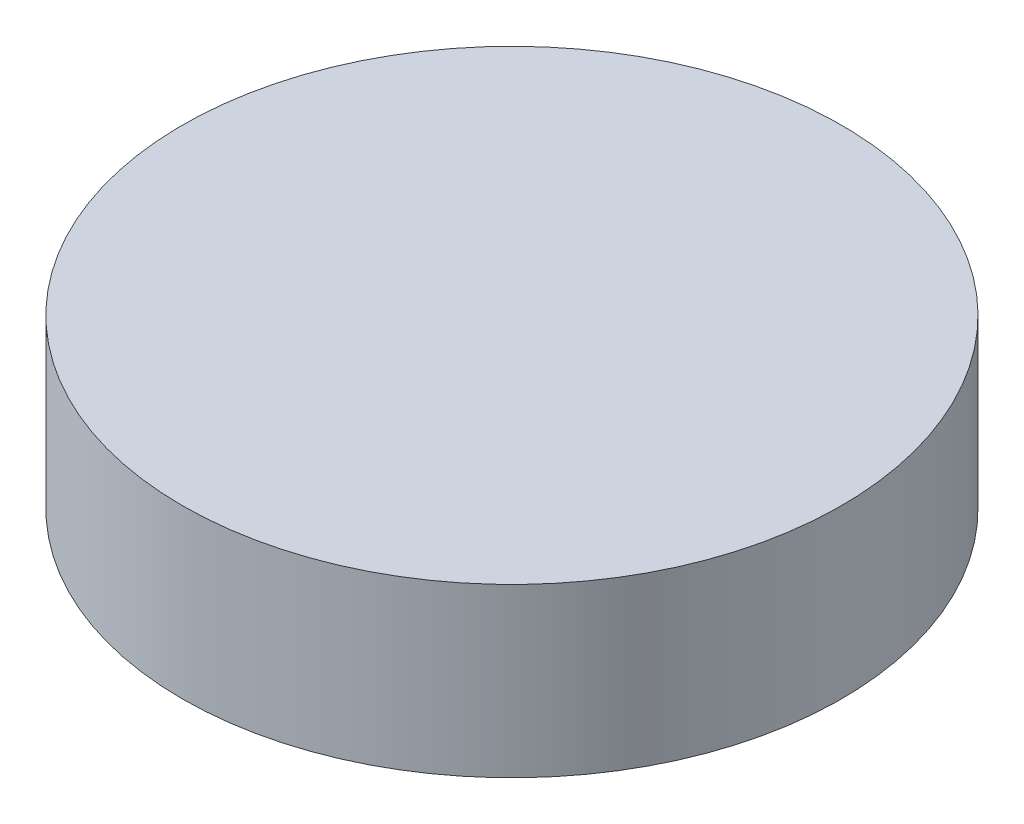
ISO-10303-21;
HEADER;
FILE_DESCRIPTION(('STEP AP214'),'2;1');
FILE_NAME('part.step','',(''),(''),'','','');
FILE_SCHEMA(('AUTOMOTIVE_DESIGN { 1 0 10303 214 1 1 1 1 }'));
ENDSEC;
DATA;
#1=APPLICATION_CONTEXT('core data for automotive mechanical design processes');
#2=APPLICATION_PROTOCOL_DEFINITION('international standard','automotive_design',2000,#1);
#3=PRODUCT_CONTEXT('',#1,'mechanical');
#4=PRODUCT('Part','Part','',(#3));
#5=PRODUCT_RELATED_PRODUCT_CATEGORY('part','',(#4));
#6=PRODUCT_DEFINITION_FORMATION('','',#4);
#7=PRODUCT_DEFINITION_CONTEXT('part definition',#1,'design');
#8=PRODUCT_DEFINITION('design','',#6,#7);
#9=PRODUCT_DEFINITION_SHAPE('','',#8);
#10=(LENGTH_UNIT() NAMED_UNIT(*) SI_UNIT(.MILLI.,.METRE.));
#11=(NAMED_UNIT(*) PLANE_ANGLE_UNIT() SI_UNIT($,.RADIAN.));
#12=(NAMED_UNIT(*) SI_UNIT($,.STERADIAN.) SOLID_ANGLE_UNIT());
#13=UNCERTAINTY_MEASURE_WITH_UNIT(LENGTH_MEASURE(1.E-05),#10,'distance_accuracy_value','');
#14=(GEOMETRIC_REPRESENTATION_CONTEXT(3) GLOBAL_UNCERTAINTY_ASSIGNED_CONTEXT((#13)) GLOBAL_UNIT_ASSIGNED_CONTEXT((#10,
#11,#12)) REPRESENTATION_CONTEXT('',''));
#15=CARTESIAN_POINT('',(0.,0.,0.));
#16=DIRECTION('',(0.,0.,1.));
#17=DIRECTION('',(1.,0.,0.));
#18=AXIS2_PLACEMENT_3D('',#15,#16,#17);
#19=CARTESIAN_POINT('',(0.,2.54,0.));
#20=DIRECTION('',(0.,-1.,0.));
#21=DIRECTION('',(0.,0.,-1.));
#22=AXIS2_PLACEMENT_3D('',#19,#20,#21);
#23=CYLINDRICAL_SURFACE('',#22,5.);
#24=CARTESIAN_POINT('',(0.,2.54,0.));
#25=DIRECTION('',(0.,1.,0.));
#26=DIRECTION('',(0.,0.,1.));
#27=AXIS2_PLACEMENT_3D('',#24,#25,#26);
#28=CIRCLE('',#27,5.);
#29=CARTESIAN_POINT('',(0.,2.54,5.));
#30=VERTEX_POINT('',#29);
#31=EDGE_CURVE('E10',#30,#30,#28,.T.);
#32=ORIENTED_EDGE('',*,*,#31,.F.);
#33=EDGE_LOOP('',(#32));
#34=FACE_BOUND('',#33,.T.);
#35=CARTESIAN_POINT('',(0.,0.,0.));
#36=DIRECTION('',(0.,1.,0.));
#37=DIRECTION('',(0.,0.,1.));
#38=AXIS2_PLACEMENT_3D('',#35,#36,#37);
#39=CIRCLE('',#38,5.);
#40=CARTESIAN_POINT('',(0.,0.,5.));
#41=VERTEX_POINT('',#40);
#42=EDGE_CURVE('E34',#41,#41,#39,.T.);
#43=ORIENTED_EDGE('',*,*,#42,.T.);
#44=EDGE_LOOP('',(#43));
#45=FACE_BOUND('',#44,.T.);
#46=ADVANCED_FACE('F31',(#34,#45),#23,.T.);
#47=CARTESIAN_POINT('',(0.,2.54,0.));
#48=DIRECTION('',(0.,1.,0.));
#49=DIRECTION('',(0.,0.,1.));
#50=AXIS2_PLACEMENT_3D('',#47,#48,#49);
#51=PLANE('',#50);
#52=ORIENTED_EDGE('',*,*,#31,.T.);
#53=EDGE_LOOP('',(#52));
#54=FACE_BOUND('',#53,.T.);
#55=ADVANCED_FACE('F46',(#54),#51,.T.);
#56=CARTESIAN_POINT('',(0.,0.,0.));
#57=DIRECTION('',(0.,1.,0.));
#58=DIRECTION('',(0.,0.,1.));
#59=AXIS2_PLACEMENT_3D('',#56,#57,#58);
#60=PLANE('',#59);
#61=ORIENTED_EDGE('',*,*,#42,.F.);
#62=EDGE_LOOP('',(#61));
#63=FACE_BOUND('',#62,.T.);
#64=ADVANCED_FACE('F44',(#63),#60,.F.);
#65=CLOSED_SHELL('',(#46,#55,#64));
#66=MANIFOLD_SOLID_BREP('B2',#65);
#67=ADVANCED_BREP_SHAPE_REPRESENTATION('',(#18,#66),#14);
#68=SHAPE_DEFINITION_REPRESENTATION(#9,#67);
ENDSEC;
END-ISO-10303-21;
